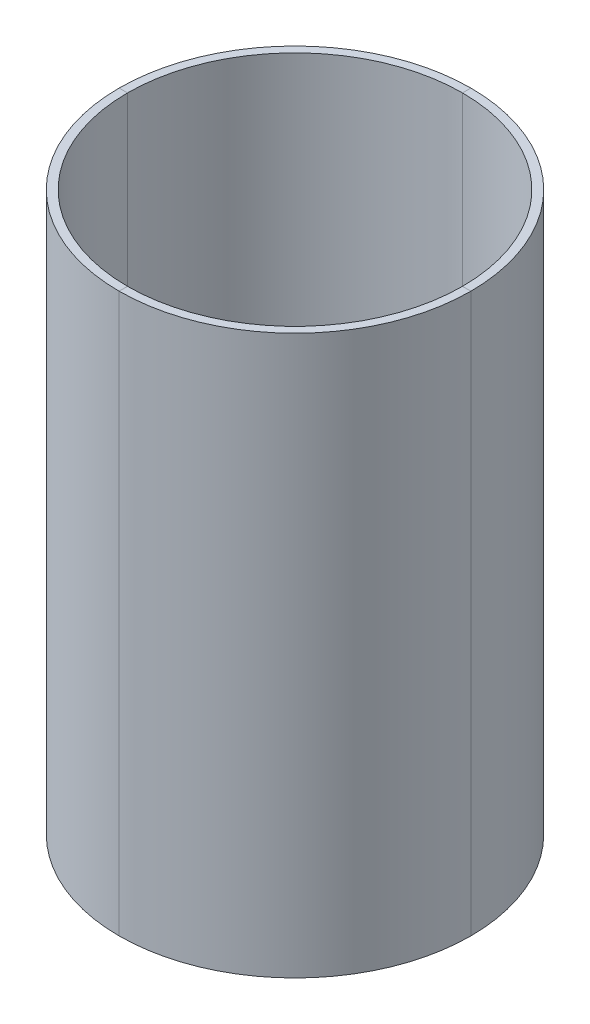
ISO-10303-21;
HEADER;
FILE_DESCRIPTION(('STEP AP214'),'2;1');
FILE_NAME('part.step','',(''),(''),'','','');
FILE_SCHEMA(('AUTOMOTIVE_DESIGN { 1 0 10303 214 1 1 1 1 }'));
ENDSEC;
DATA;
#1=APPLICATION_CONTEXT('core data for automotive mechanical design processes');
#2=APPLICATION_PROTOCOL_DEFINITION('international standard','automotive_design',2000,#1);
#3=PRODUCT_CONTEXT('',#1,'mechanical');
#4=PRODUCT('Part','Part','',(#3));
#5=PRODUCT_RELATED_PRODUCT_CATEGORY('part','',(#4));
#6=PRODUCT_DEFINITION_FORMATION('','',#4);
#7=PRODUCT_DEFINITION_CONTEXT('part definition',#1,'design');
#8=PRODUCT_DEFINITION('design','',#6,#7);
#9=PRODUCT_DEFINITION_SHAPE('','',#8);
#10=(LENGTH_UNIT() NAMED_UNIT(*) SI_UNIT(.MILLI.,.METRE.));
#11=(NAMED_UNIT(*) PLANE_ANGLE_UNIT() SI_UNIT($,.RADIAN.));
#12=(NAMED_UNIT(*) SI_UNIT($,.STERADIAN.) SOLID_ANGLE_UNIT());
#13=UNCERTAINTY_MEASURE_WITH_UNIT(LENGTH_MEASURE(1.E-05),#10,'distance_accuracy_value','');
#14=(GEOMETRIC_REPRESENTATION_CONTEXT(3) GLOBAL_UNCERTAINTY_ASSIGNED_CONTEXT((#13)) GLOBAL_UNIT_ASSIGNED_CONTEXT((#10,
#11,#12)) REPRESENTATION_CONTEXT('',''));
#15=CARTESIAN_POINT('',(0.,0.,0.));
#16=DIRECTION('',(0.,0.,1.));
#17=DIRECTION('',(1.,0.,0.));
#18=AXIS2_PLACEMENT_3D('',#15,#16,#17);
#19=CARTESIAN_POINT('',(-31.51,0.,0.01));
#20=DIRECTION('',(0.,-1.,0.));
#21=DIRECTION('',(0.,0.,-1.));
#22=AXIS2_PLACEMENT_3D('',#19,#20,#21);
#23=PLANE('',#22);
#24=DIRECTION('',(0.,0.,-1.));
#25=VECTOR('',#24,1.);
#26=CARTESIAN_POINT('',(0.,0.,-30.75));
#27=LINE('',#26,#25);
#28=CARTESIAN_POINT('',(0.,0.,-30.));
#29=VERTEX_POINT('',#28);
#30=CARTESIAN_POINT('',(0.,0.,-31.5));
#31=VERTEX_POINT('',#30);
#32=EDGE_CURVE('P0_E80',#29,#31,#27,.T.);
#33=ORIENTED_EDGE('',*,*,#32,.F.);
#34=CARTESIAN_POINT('',(0.,0.,0.));
#35=DIRECTION('',(0.,1.,0.));
#36=DIRECTION('',(0.,0.,1.));
#37=AXIS2_PLACEMENT_3D('',#34,#35,#36);
#38=CIRCLE('',#37,30.);
#39=CARTESIAN_POINT('',(-30.,0.,0.));
#40=VERTEX_POINT('',#39);
#41=EDGE_CURVE('P0_E74',#40,#29,#38,.F.);
#42=ORIENTED_EDGE('',*,*,#41,.F.);
#43=DIRECTION('',(-1.,0.,0.));
#44=VECTOR('',#43,1.);
#45=CARTESIAN_POINT('',(-15.75,0.,0.));
#46=LINE('',#45,#44);
#47=CARTESIAN_POINT('',(-31.5,0.,0.));
#48=VERTEX_POINT('',#47);
#49=EDGE_CURVE('P0_E82',#40,#48,#46,.T.);
#50=ORIENTED_EDGE('',*,*,#49,.T.);
#51=CARTESIAN_POINT('',(0.,0.,0.));
#52=DIRECTION('',(0.,-1.,0.));
#53=DIRECTION('',(0.,0.,-1.));
#54=AXIS2_PLACEMENT_3D('',#51,#52,#53);
#55=CIRCLE('',#54,31.5);
#56=EDGE_CURVE('P0_E76',#31,#48,#55,.F.);
#57=ORIENTED_EDGE('',*,*,#56,.F.);
#58=EDGE_LOOP('',(#33,#42,#50,#57));
#59=FACE_BOUND('',#58,.T.);
#60=ADVANCED_FACE('P0_F16',(#59),#23,.T.);
#61=CARTESIAN_POINT('',(0.,-0.01,-29.99));
#62=DIRECTION('',(1.,0.,0.));
#63=DIRECTION('',(0.,0.,-1.));
#64=AXIS2_PLACEMENT_3D('',#61,#62,#63);
#65=PLANE('',#64);
#66=DIRECTION('',(0.,1.,0.));
#67=VECTOR('',#66,1.);
#68=CARTESIAN_POINT('',(0.,50.,-30.));
#69=LINE('',#68,#67);
#70=CARTESIAN_POINT('',(0.,100.,-30.));
#71=VERTEX_POINT('',#70);
#72=EDGE_CURVE('P0_E61',#29,#71,#69,.T.);
#73=ORIENTED_EDGE('',*,*,#72,.F.);
#74=ORIENTED_EDGE('',*,*,#32,.T.);
#75=DIRECTION('',(0.,-1.,0.));
#76=VECTOR('',#75,1.);
#77=CARTESIAN_POINT('',(0.,50.,-31.5));
#78=LINE('',#77,#76);
#79=CARTESIAN_POINT('',(0.,100.,-31.5));
#80=VERTEX_POINT('',#79);
#81=EDGE_CURVE('P0_E64',#80,#31,#78,.T.);
#82=ORIENTED_EDGE('',*,*,#81,.F.);
#83=DIRECTION('',(0.,0.,-1.));
#84=VECTOR('',#83,1.);
#85=CARTESIAN_POINT('',(0.,100.,-15.75));
#86=LINE('',#85,#84);
#87=EDGE_CURVE('P0_E58',#71,#80,#86,.T.);
#88=ORIENTED_EDGE('',*,*,#87,.F.);
#89=EDGE_LOOP('',(#73,#74,#82,#88));
#90=FACE_BOUND('',#89,.T.);
#91=ADVANCED_FACE('P0_F59',(#90),#65,.T.);
#92=CARTESIAN_POINT('',(-31.51,100.,-31.51));
#93=DIRECTION('',(0.,1.,0.));
#94=DIRECTION('',(0.,0.,1.));
#95=AXIS2_PLACEMENT_3D('',#92,#93,#94);
#96=PLANE('',#95);
#97=ORIENTED_EDGE('',*,*,#87,.T.);
#98=CARTESIAN_POINT('',(0.,100.,0.));
#99=DIRECTION('',(0.,-1.,0.));
#100=DIRECTION('',(0.,0.,-1.));
#101=AXIS2_PLACEMENT_3D('',#98,#99,#100);
#102=CIRCLE('',#101,31.5);
#103=CARTESIAN_POINT('',(-31.5,100.,0.));
#104=VERTEX_POINT('',#103);
#105=EDGE_CURVE('P0_E20',#104,#80,#102,.T.);
#106=ORIENTED_EDGE('',*,*,#105,.F.);
#107=DIRECTION('',(1.,0.,0.));
#108=VECTOR('',#107,1.);
#109=CARTESIAN_POINT('',(-15.75,100.,0.));
#110=LINE('',#109,#108);
#111=CARTESIAN_POINT('',(-30.,100.,0.));
#112=VERTEX_POINT('',#111);
#113=EDGE_CURVE('P0_E35',#104,#112,#110,.T.);
#114=ORIENTED_EDGE('',*,*,#113,.T.);
#115=CARTESIAN_POINT('',(0.,100.,0.));
#116=DIRECTION('',(0.,1.,0.));
#117=DIRECTION('',(0.,0.,1.));
#118=AXIS2_PLACEMENT_3D('',#115,#116,#117);
#119=CIRCLE('',#118,30.);
#120=EDGE_CURVE('P0_E67',#71,#112,#119,.T.);
#121=ORIENTED_EDGE('',*,*,#120,.F.);
#122=EDGE_LOOP('',(#97,#106,#114,#121));
#123=FACE_BOUND('',#122,.T.);
#124=ADVANCED_FACE('P0_F68',(#123),#96,.T.);
#125=CARTESIAN_POINT('',(0.,100.,0.));
#126=DIRECTION('',(0.,-1.,0.));
#127=DIRECTION('',(0.,0.,-1.));
#128=AXIS2_PLACEMENT_3D('',#125,#126,#127);
#129=CYLINDRICAL_SURFACE('',#128,31.5);
#130=ORIENTED_EDGE('',*,*,#81,.T.);
#131=ORIENTED_EDGE('',*,*,#56,.T.);
#132=DIRECTION('',(0.,-1.,0.));
#133=VECTOR('',#132,1.);
#134=CARTESIAN_POINT('',(-31.5,50.,0.));
#135=LINE('',#134,#133);
#136=EDGE_CURVE('P0_E26',#104,#48,#135,.T.);
#137=ORIENTED_EDGE('',*,*,#136,.F.);
#138=ORIENTED_EDGE('',*,*,#105,.T.);
#139=EDGE_LOOP('',(#130,#131,#137,#138));
#140=FACE_BOUND('',#139,.T.);
#141=ADVANCED_FACE('P0_F89',(#140),#129,.T.);
#142=CARTESIAN_POINT('',(0.,0.,0.));
#143=DIRECTION('',(0.,1.,0.));
#144=DIRECTION('',(0.,0.,1.));
#145=AXIS2_PLACEMENT_3D('',#142,#143,#144);
#146=CYLINDRICAL_SURFACE('',#145,30.);
#147=ORIENTED_EDGE('',*,*,#72,.T.);
#148=ORIENTED_EDGE('',*,*,#120,.T.);
#149=DIRECTION('',(0.,1.,0.));
#150=VECTOR('',#149,1.);
#151=CARTESIAN_POINT('',(-30.,50.,0.));
#152=LINE('',#151,#150);
#153=EDGE_CURVE('P0_E11',#40,#112,#152,.T.);
#154=ORIENTED_EDGE('',*,*,#153,.F.);
#155=ORIENTED_EDGE('',*,*,#41,.T.);
#156=EDGE_LOOP('',(#147,#148,#154,#155));
#157=FACE_BOUND('',#156,.T.);
#158=ADVANCED_FACE('P0_F72',(#157),#146,.F.);
#159=CARTESIAN_POINT('',(-31.51,-0.01,0.));
#160=DIRECTION('',(0.,0.,1.));
#161=DIRECTION('',(1.,0.,0.));
#162=AXIS2_PLACEMENT_3D('',#159,#160,#161);
#163=PLANE('',#162);
#164=ORIENTED_EDGE('',*,*,#153,.T.);
#165=ORIENTED_EDGE('',*,*,#113,.F.);
#166=ORIENTED_EDGE('',*,*,#136,.T.);
#167=ORIENTED_EDGE('',*,*,#49,.F.);
#168=EDGE_LOOP('',(#164,#165,#166,#167));
#169=FACE_BOUND('',#168,.T.);
#170=ADVANCED_FACE('P0_F18',(#169),#163,.T.);
#171=CLOSED_SHELL('',(#60,#91,#124,#141,#158,#170));
#172=MANIFOLD_SOLID_BREP('P0_B1',#171);
#173=CARTESIAN_POINT('',(-31.51,100.,-0.01));
#174=DIRECTION('',(0.,1.,0.));
#175=DIRECTION('',(0.,0.,1.));
#176=AXIS2_PLACEMENT_3D('',#173,#174,#175);
#177=PLANE('',#176);
#178=DIRECTION('',(0.,0.,1.));
#179=VECTOR('',#178,1.);
#180=CARTESIAN_POINT('',(0.,100.,30.75));
#181=LINE('',#180,#179);
#182=CARTESIAN_POINT('',(0.,100.,30.));
#183=VERTEX_POINT('',#182);
#184=CARTESIAN_POINT('',(0.,100.,31.5));
#185=VERTEX_POINT('',#184);
#186=EDGE_CURVE('P1_E80',#183,#185,#181,.T.);
#187=ORIENTED_EDGE('',*,*,#186,.F.);
#188=CARTESIAN_POINT('',(0.,100.,0.));
#189=DIRECTION('',(0.,1.,0.));
#190=DIRECTION('',(0.,0.,1.));
#191=AXIS2_PLACEMENT_3D('',#188,#189,#190);
#192=CIRCLE('',#191,30.);
#193=CARTESIAN_POINT('',(-30.,100.,0.));
#194=VERTEX_POINT('',#193);
#195=EDGE_CURVE('P1_E74',#194,#183,#192,.T.);
#196=ORIENTED_EDGE('',*,*,#195,.F.);
#197=DIRECTION('',(-1.,0.,0.));
#198=VECTOR('',#197,1.);
#199=CARTESIAN_POINT('',(-15.75,100.,0.));
#200=LINE('',#199,#198);
#201=CARTESIAN_POINT('',(-31.5,100.,0.));
#202=VERTEX_POINT('',#201);
#203=EDGE_CURVE('P1_E82',#194,#202,#200,.T.);
#204=ORIENTED_EDGE('',*,*,#203,.T.);
#205=CARTESIAN_POINT('',(0.,100.,0.));
#206=DIRECTION('',(0.,-1.,0.));
#207=DIRECTION('',(0.,0.,-1.));
#208=AXIS2_PLACEMENT_3D('',#205,#206,#207);
#209=CIRCLE('',#208,31.5);
#210=EDGE_CURVE('P1_E76',#185,#202,#209,.T.);
#211=ORIENTED_EDGE('',*,*,#210,.F.);
#212=EDGE_LOOP('',(#187,#196,#204,#211));
#213=FACE_BOUND('',#212,.T.);
#214=ADVANCED_FACE('P1_F16',(#213),#177,.T.);
#215=CARTESIAN_POINT('',(0.,-0.01,31.51));
#216=DIRECTION('',(1.,0.,0.));
#217=DIRECTION('',(0.,0.,-1.));
#218=AXIS2_PLACEMENT_3D('',#215,#216,#217);
#219=PLANE('',#218);
#220=DIRECTION('',(0.,-1.,0.));
#221=VECTOR('',#220,1.);
#222=CARTESIAN_POINT('',(0.,50.,30.));
#223=LINE('',#222,#221);
#224=CARTESIAN_POINT('',(0.,0.,30.));
#225=VERTEX_POINT('',#224);
#226=EDGE_CURVE('P1_E61',#183,#225,#223,.T.);
#227=ORIENTED_EDGE('',*,*,#226,.F.);
#228=ORIENTED_EDGE('',*,*,#186,.T.);
#229=DIRECTION('',(0.,1.,0.));
#230=VECTOR('',#229,1.);
#231=CARTESIAN_POINT('',(0.,50.,31.5));
#232=LINE('',#231,#230);
#233=CARTESIAN_POINT('',(0.,0.,31.5));
#234=VERTEX_POINT('',#233);
#235=EDGE_CURVE('P1_E64',#234,#185,#232,.T.);
#236=ORIENTED_EDGE('',*,*,#235,.F.);
#237=DIRECTION('',(0.,0.,1.));
#238=VECTOR('',#237,1.);
#239=CARTESIAN_POINT('',(0.,0.,15.75));
#240=LINE('',#239,#238);
#241=EDGE_CURVE('P1_E58',#225,#234,#240,.T.);
#242=ORIENTED_EDGE('',*,*,#241,.F.);
#243=EDGE_LOOP('',(#227,#228,#236,#242));
#244=FACE_BOUND('',#243,.T.);
#245=ADVANCED_FACE('P1_F59',(#244),#219,.T.);
#246=CARTESIAN_POINT('',(-31.51,0.,31.51));
#247=DIRECTION('',(0.,-1.,0.));
#248=DIRECTION('',(0.,0.,-1.));
#249=AXIS2_PLACEMENT_3D('',#246,#247,#248);
#250=PLANE('',#249);
#251=ORIENTED_EDGE('',*,*,#241,.T.);
#252=CARTESIAN_POINT('',(0.,0.,0.));
#253=DIRECTION('',(0.,-1.,0.));
#254=DIRECTION('',(0.,0.,-1.));
#255=AXIS2_PLACEMENT_3D('',#252,#253,#254);
#256=CIRCLE('',#255,31.5);
#257=CARTESIAN_POINT('',(-31.5,0.,0.));
#258=VERTEX_POINT('',#257);
#259=EDGE_CURVE('P1_E20',#258,#234,#256,.F.);
#260=ORIENTED_EDGE('',*,*,#259,.F.);
#261=DIRECTION('',(1.,0.,0.));
#262=VECTOR('',#261,1.);
#263=CARTESIAN_POINT('',(-15.75,0.,0.));
#264=LINE('',#263,#262);
#265=CARTESIAN_POINT('',(-30.,0.,0.));
#266=VERTEX_POINT('',#265);
#267=EDGE_CURVE('P1_E35',#258,#266,#264,.T.);
#268=ORIENTED_EDGE('',*,*,#267,.T.);
#269=CARTESIAN_POINT('',(0.,0.,0.));
#270=DIRECTION('',(0.,1.,0.));
#271=DIRECTION('',(0.,0.,1.));
#272=AXIS2_PLACEMENT_3D('',#269,#270,#271);
#273=CIRCLE('',#272,30.);
#274=EDGE_CURVE('P1_E67',#225,#266,#273,.F.);
#275=ORIENTED_EDGE('',*,*,#274,.F.);
#276=EDGE_LOOP('',(#251,#260,#268,#275));
#277=FACE_BOUND('',#276,.T.);
#278=ADVANCED_FACE('P1_F68',(#277),#250,.T.);
#279=CARTESIAN_POINT('',(0.,100.,0.));
#280=DIRECTION('',(0.,-1.,0.));
#281=DIRECTION('',(0.,0.,-1.));
#282=AXIS2_PLACEMENT_3D('',#279,#280,#281);
#283=CYLINDRICAL_SURFACE('',#282,31.5);
#284=ORIENTED_EDGE('',*,*,#235,.T.);
#285=ORIENTED_EDGE('',*,*,#210,.T.);
#286=DIRECTION('',(0.,1.,0.));
#287=VECTOR('',#286,1.);
#288=CARTESIAN_POINT('',(-31.5,50.,0.));
#289=LINE('',#288,#287);
#290=EDGE_CURVE('P1_E26',#258,#202,#289,.T.);
#291=ORIENTED_EDGE('',*,*,#290,.F.);
#292=ORIENTED_EDGE('',*,*,#259,.T.);
#293=EDGE_LOOP('',(#284,#285,#291,#292));
#294=FACE_BOUND('',#293,.T.);
#295=ADVANCED_FACE('P1_F89',(#294),#283,.T.);
#296=CARTESIAN_POINT('',(0.,0.,0.));
#297=DIRECTION('',(0.,1.,0.));
#298=DIRECTION('',(0.,0.,1.));
#299=AXIS2_PLACEMENT_3D('',#296,#297,#298);
#300=CYLINDRICAL_SURFACE('',#299,30.);
#301=ORIENTED_EDGE('',*,*,#226,.T.);
#302=ORIENTED_EDGE('',*,*,#274,.T.);
#303=DIRECTION('',(0.,-1.,0.));
#304=VECTOR('',#303,1.);
#305=CARTESIAN_POINT('',(-30.,50.,0.));
#306=LINE('',#305,#304);
#307=EDGE_CURVE('P1_E11',#194,#266,#306,.T.);
#308=ORIENTED_EDGE('',*,*,#307,.F.);
#309=ORIENTED_EDGE('',*,*,#195,.T.);
#310=EDGE_LOOP('',(#301,#302,#308,#309));
#311=FACE_BOUND('',#310,.T.);
#312=ADVANCED_FACE('P1_F72',(#311),#300,.F.);
#313=CARTESIAN_POINT('',(-29.99,-0.01,0.));
#314=DIRECTION('',(0.,0.,-1.));
#315=DIRECTION('',(-1.,0.,0.));
#316=AXIS2_PLACEMENT_3D('',#313,#314,#315);
#317=PLANE('',#316);
#318=ORIENTED_EDGE('',*,*,#307,.T.);
#319=ORIENTED_EDGE('',*,*,#267,.F.);
#320=ORIENTED_EDGE('',*,*,#290,.T.);
#321=ORIENTED_EDGE('',*,*,#203,.F.);
#322=EDGE_LOOP('',(#318,#319,#320,#321));
#323=FACE_BOUND('',#322,.T.);
#324=ADVANCED_FACE('P1_F18',(#323),#317,.T.);
#325=CLOSED_SHELL('',(#214,#245,#278,#295,#312,#324));
#326=MANIFOLD_SOLID_BREP('P1_B1',#325);
#327=CARTESIAN_POINT('',(-0.01,0.,31.51));
#328=DIRECTION('',(0.,-1.,0.));
#329=DIRECTION('',(0.,0.,-1.));
#330=AXIS2_PLACEMENT_3D('',#327,#328,#329);
#331=PLANE('',#330);
#332=DIRECTION('',(0.,0.,1.));
#333=VECTOR('',#332,1.);
#334=CARTESIAN_POINT('',(0.,0.,30.75));
#335=LINE('',#334,#333);
#336=CARTESIAN_POINT('',(0.,0.,30.));
#337=VERTEX_POINT('',#336);
#338=CARTESIAN_POINT('',(0.,0.,31.5));
#339=VERTEX_POINT('',#338);
#340=EDGE_CURVE('P2_E80',#337,#339,#335,.T.);
#341=ORIENTED_EDGE('',*,*,#340,.F.);
#342=CARTESIAN_POINT('',(0.,0.,0.));
#343=DIRECTION('',(0.,1.,0.));
#344=DIRECTION('',(0.,0.,1.));
#345=AXIS2_PLACEMENT_3D('',#342,#343,#344);
#346=CIRCLE('',#345,30.);
#347=CARTESIAN_POINT('',(30.,0.,0.));
#348=VERTEX_POINT('',#347);
#349=EDGE_CURVE('P2_E74',#348,#337,#346,.F.);
#350=ORIENTED_EDGE('',*,*,#349,.F.);
#351=DIRECTION('',(1.,0.,0.));
#352=VECTOR('',#351,1.);
#353=CARTESIAN_POINT('',(15.75,0.,0.));
#354=LINE('',#353,#352);
#355=CARTESIAN_POINT('',(31.5,0.,0.));
#356=VERTEX_POINT('',#355);
#357=EDGE_CURVE('P2_E82',#348,#356,#354,.T.);
#358=ORIENTED_EDGE('',*,*,#357,.T.);
#359=CARTESIAN_POINT('',(0.,0.,0.));
#360=DIRECTION('',(0.,-1.,0.));
#361=DIRECTION('',(0.,0.,-1.));
#362=AXIS2_PLACEMENT_3D('',#359,#360,#361);
#363=CIRCLE('',#362,31.5);
#364=EDGE_CURVE('P2_E76',#339,#356,#363,.F.);
#365=ORIENTED_EDGE('',*,*,#364,.F.);
#366=EDGE_LOOP('',(#341,#350,#358,#365));
#367=FACE_BOUND('',#366,.T.);
#368=ADVANCED_FACE('P2_F16',(#367),#331,.T.);
#369=CARTESIAN_POINT('',(0.,-0.01,29.99));
#370=DIRECTION('',(-1.,0.,0.));
#371=DIRECTION('',(0.,0.,1.));
#372=AXIS2_PLACEMENT_3D('',#369,#370,#371);
#373=PLANE('',#372);
#374=DIRECTION('',(0.,1.,0.));
#375=VECTOR('',#374,1.);
#376=CARTESIAN_POINT('',(0.,50.,30.));
#377=LINE('',#376,#375);
#378=CARTESIAN_POINT('',(0.,100.,30.));
#379=VERTEX_POINT('',#378);
#380=EDGE_CURVE('P2_E61',#337,#379,#377,.T.);
#381=ORIENTED_EDGE('',*,*,#380,.F.);
#382=ORIENTED_EDGE('',*,*,#340,.T.);
#383=DIRECTION('',(0.,-1.,0.));
#384=VECTOR('',#383,1.);
#385=CARTESIAN_POINT('',(0.,50.,31.5));
#386=LINE('',#385,#384);
#387=CARTESIAN_POINT('',(0.,100.,31.5));
#388=VERTEX_POINT('',#387);
#389=EDGE_CURVE('P2_E64',#388,#339,#386,.T.);
#390=ORIENTED_EDGE('',*,*,#389,.F.);
#391=DIRECTION('',(0.,0.,1.));
#392=VECTOR('',#391,1.);
#393=CARTESIAN_POINT('',(0.,100.,15.75));
#394=LINE('',#393,#392);
#395=EDGE_CURVE('P2_E58',#379,#388,#394,.T.);
#396=ORIENTED_EDGE('',*,*,#395,.F.);
#397=EDGE_LOOP('',(#381,#382,#390,#396));
#398=FACE_BOUND('',#397,.T.);
#399=ADVANCED_FACE('P2_F59',(#398),#373,.T.);
#400=CARTESIAN_POINT('',(-0.01,100.,-0.01));
#401=DIRECTION('',(0.,1.,0.));
#402=DIRECTION('',(0.,0.,1.));
#403=AXIS2_PLACEMENT_3D('',#400,#401,#402);
#404=PLANE('',#403);
#405=ORIENTED_EDGE('',*,*,#395,.T.);
#406=CARTESIAN_POINT('',(0.,100.,0.));
#407=DIRECTION('',(0.,-1.,0.));
#408=DIRECTION('',(0.,0.,-1.));
#409=AXIS2_PLACEMENT_3D('',#406,#407,#408);
#410=CIRCLE('',#409,31.5);
#411=CARTESIAN_POINT('',(31.5,100.,0.));
#412=VERTEX_POINT('',#411);
#413=EDGE_CURVE('P2_E20',#412,#388,#410,.T.);
#414=ORIENTED_EDGE('',*,*,#413,.F.);
#415=DIRECTION('',(-1.,0.,0.));
#416=VECTOR('',#415,1.);
#417=CARTESIAN_POINT('',(15.75,100.,0.));
#418=LINE('',#417,#416);
#419=CARTESIAN_POINT('',(30.,100.,0.));
#420=VERTEX_POINT('',#419);
#421=EDGE_CURVE('P2_E35',#412,#420,#418,.T.);
#422=ORIENTED_EDGE('',*,*,#421,.T.);
#423=CARTESIAN_POINT('',(0.,100.,0.));
#424=DIRECTION('',(0.,1.,0.));
#425=DIRECTION('',(0.,0.,1.));
#426=AXIS2_PLACEMENT_3D('',#423,#424,#425);
#427=CIRCLE('',#426,30.);
#428=EDGE_CURVE('P2_E67',#379,#420,#427,.T.);
#429=ORIENTED_EDGE('',*,*,#428,.F.);
#430=EDGE_LOOP('',(#405,#414,#422,#429));
#431=FACE_BOUND('',#430,.T.);
#432=ADVANCED_FACE('P2_F68',(#431),#404,.T.);
#433=CARTESIAN_POINT('',(0.,100.,0.));
#434=DIRECTION('',(0.,-1.,0.));
#435=DIRECTION('',(0.,0.,-1.));
#436=AXIS2_PLACEMENT_3D('',#433,#434,#435);
#437=CYLINDRICAL_SURFACE('',#436,31.5);
#438=ORIENTED_EDGE('',*,*,#389,.T.);
#439=ORIENTED_EDGE('',*,*,#364,.T.);
#440=DIRECTION('',(0.,-1.,0.));
#441=VECTOR('',#440,1.);
#442=CARTESIAN_POINT('',(31.5,50.,0.));
#443=LINE('',#442,#441);
#444=EDGE_CURVE('P2_E26',#412,#356,#443,.T.);
#445=ORIENTED_EDGE('',*,*,#444,.F.);
#446=ORIENTED_EDGE('',*,*,#413,.T.);
#447=EDGE_LOOP('',(#438,#439,#445,#446));
#448=FACE_BOUND('',#447,.T.);
#449=ADVANCED_FACE('P2_F89',(#448),#437,.T.);
#450=CARTESIAN_POINT('',(0.,0.,0.));
#451=DIRECTION('',(0.,1.,0.));
#452=DIRECTION('',(0.,0.,1.));
#453=AXIS2_PLACEMENT_3D('',#450,#451,#452);
#454=CYLINDRICAL_SURFACE('',#453,30.);
#455=ORIENTED_EDGE('',*,*,#380,.T.);
#456=ORIENTED_EDGE('',*,*,#428,.T.);
#457=DIRECTION('',(0.,1.,0.));
#458=VECTOR('',#457,1.);
#459=CARTESIAN_POINT('',(30.,50.,0.));
#460=LINE('',#459,#458);
#461=EDGE_CURVE('P2_E11',#348,#420,#460,.T.);
#462=ORIENTED_EDGE('',*,*,#461,.F.);
#463=ORIENTED_EDGE('',*,*,#349,.T.);
#464=EDGE_LOOP('',(#455,#456,#462,#463));
#465=FACE_BOUND('',#464,.T.);
#466=ADVANCED_FACE('P2_F72',(#465),#454,.F.);
#467=CARTESIAN_POINT('',(31.51,-0.01,0.));
#468=DIRECTION('',(0.,0.,-1.));
#469=DIRECTION('',(-1.,0.,0.));
#470=AXIS2_PLACEMENT_3D('',#467,#468,#469);
#471=PLANE('',#470);
#472=ORIENTED_EDGE('',*,*,#461,.T.);
#473=ORIENTED_EDGE('',*,*,#421,.F.);
#474=ORIENTED_EDGE('',*,*,#444,.T.);
#475=ORIENTED_EDGE('',*,*,#357,.F.);
#476=EDGE_LOOP('',(#472,#473,#474,#475));
#477=FACE_BOUND('',#476,.T.);
#478=ADVANCED_FACE('P2_F18',(#477),#471,.T.);
#479=CLOSED_SHELL('',(#368,#399,#432,#449,#466,#478));
#480=MANIFOLD_SOLID_BREP('P2_B1',#479);
#481=CARTESIAN_POINT('',(-0.01,100.,-31.51));
#482=DIRECTION('',(0.,1.,0.));
#483=DIRECTION('',(0.,0.,1.));
#484=AXIS2_PLACEMENT_3D('',#481,#482,#483);
#485=PLANE('',#484);
#486=DIRECTION('',(0.,0.,-1.));
#487=VECTOR('',#486,1.);
#488=CARTESIAN_POINT('',(0.,100.,-30.75));
#489=LINE('',#488,#487);
#490=CARTESIAN_POINT('',(0.,100.,-30.));
#491=VERTEX_POINT('',#490);
#492=CARTESIAN_POINT('',(0.,100.,-31.5));
#493=VERTEX_POINT('',#492);
#494=EDGE_CURVE('P3_E80',#491,#493,#489,.T.);
#495=ORIENTED_EDGE('',*,*,#494,.F.);
#496=CARTESIAN_POINT('',(0.,100.,0.));
#497=DIRECTION('',(0.,1.,0.));
#498=DIRECTION('',(0.,0.,1.));
#499=AXIS2_PLACEMENT_3D('',#496,#497,#498);
#500=CIRCLE('',#499,30.);
#501=CARTESIAN_POINT('',(30.,100.,0.));
#502=VERTEX_POINT('',#501);
#503=EDGE_CURVE('P3_E74',#502,#491,#500,.T.);
#504=ORIENTED_EDGE('',*,*,#503,.F.);
#505=DIRECTION('',(1.,0.,0.));
#506=VECTOR('',#505,1.);
#507=CARTESIAN_POINT('',(15.75,100.,0.));
#508=LINE('',#507,#506);
#509=CARTESIAN_POINT('',(31.5,100.,0.));
#510=VERTEX_POINT('',#509);
#511=EDGE_CURVE('P3_E82',#502,#510,#508,.T.);
#512=ORIENTED_EDGE('',*,*,#511,.T.);
#513=CARTESIAN_POINT('',(0.,100.,0.));
#514=DIRECTION('',(0.,-1.,0.));
#515=DIRECTION('',(0.,0.,-1.));
#516=AXIS2_PLACEMENT_3D('',#513,#514,#515);
#517=CIRCLE('',#516,31.5);
#518=EDGE_CURVE('P3_E76',#493,#510,#517,.T.);
#519=ORIENTED_EDGE('',*,*,#518,.F.);
#520=EDGE_LOOP('',(#495,#504,#512,#519));
#521=FACE_BOUND('',#520,.T.);
#522=ADVANCED_FACE('P3_F16',(#521),#485,.T.);
#523=CARTESIAN_POINT('',(0.,-0.01,-31.51));
#524=DIRECTION('',(-1.,0.,0.));
#525=DIRECTION('',(0.,0.,1.));
#526=AXIS2_PLACEMENT_3D('',#523,#524,#525);
#527=PLANE('',#526);
#528=DIRECTION('',(0.,-1.,0.));
#529=VECTOR('',#528,1.);
#530=CARTESIAN_POINT('',(0.,50.,-30.));
#531=LINE('',#530,#529);
#532=CARTESIAN_POINT('',(0.,0.,-30.));
#533=VERTEX_POINT('',#532);
#534=EDGE_CURVE('P3_E61',#491,#533,#531,.T.);
#535=ORIENTED_EDGE('',*,*,#534,.F.);
#536=ORIENTED_EDGE('',*,*,#494,.T.);
#537=DIRECTION('',(0.,1.,0.));
#538=VECTOR('',#537,1.);
#539=CARTESIAN_POINT('',(0.,50.,-31.5));
#540=LINE('',#539,#538);
#541=CARTESIAN_POINT('',(0.,0.,-31.5));
#542=VERTEX_POINT('',#541);
#543=EDGE_CURVE('P3_E64',#542,#493,#540,.T.);
#544=ORIENTED_EDGE('',*,*,#543,.F.);
#545=DIRECTION('',(0.,0.,-1.));
#546=VECTOR('',#545,1.);
#547=CARTESIAN_POINT('',(0.,0.,-15.75));
#548=LINE('',#547,#546);
#549=EDGE_CURVE('P3_E58',#533,#542,#548,.T.);
#550=ORIENTED_EDGE('',*,*,#549,.F.);
#551=EDGE_LOOP('',(#535,#536,#544,#550));
#552=FACE_BOUND('',#551,.T.);
#553=ADVANCED_FACE('P3_F59',(#552),#527,.T.);
#554=CARTESIAN_POINT('',(-0.01,0.,0.01));
#555=DIRECTION('',(0.,-1.,0.));
#556=DIRECTION('',(0.,0.,-1.));
#557=AXIS2_PLACEMENT_3D('',#554,#555,#556);
#558=PLANE('',#557);
#559=ORIENTED_EDGE('',*,*,#549,.T.);
#560=CARTESIAN_POINT('',(0.,0.,0.));
#561=DIRECTION('',(0.,-1.,0.));
#562=DIRECTION('',(0.,0.,-1.));
#563=AXIS2_PLACEMENT_3D('',#560,#561,#562);
#564=CIRCLE('',#563,31.5);
#565=CARTESIAN_POINT('',(31.5,0.,0.));
#566=VERTEX_POINT('',#565);
#567=EDGE_CURVE('P3_E20',#566,#542,#564,.F.);
#568=ORIENTED_EDGE('',*,*,#567,.F.);
#569=DIRECTION('',(-1.,0.,0.));
#570=VECTOR('',#569,1.);
#571=CARTESIAN_POINT('',(15.75,0.,0.));
#572=LINE('',#571,#570);
#573=CARTESIAN_POINT('',(30.,0.,0.));
#574=VERTEX_POINT('',#573);
#575=EDGE_CURVE('P3_E35',#566,#574,#572,.T.);
#576=ORIENTED_EDGE('',*,*,#575,.T.);
#577=CARTESIAN_POINT('',(0.,0.,0.));
#578=DIRECTION('',(0.,1.,0.));
#579=DIRECTION('',(0.,0.,1.));
#580=AXIS2_PLACEMENT_3D('',#577,#578,#579);
#581=CIRCLE('',#580,30.);
#582=EDGE_CURVE('P3_E67',#533,#574,#581,.F.);
#583=ORIENTED_EDGE('',*,*,#582,.F.);
#584=EDGE_LOOP('',(#559,#568,#576,#583));
#585=FACE_BOUND('',#584,.T.);
#586=ADVANCED_FACE('P3_F68',(#585),#558,.T.);
#587=CARTESIAN_POINT('',(0.,100.,0.));
#588=DIRECTION('',(0.,-1.,0.));
#589=DIRECTION('',(0.,0.,-1.));
#590=AXIS2_PLACEMENT_3D('',#587,#588,#589);
#591=CYLINDRICAL_SURFACE('',#590,31.5);
#592=ORIENTED_EDGE('',*,*,#543,.T.);
#593=ORIENTED_EDGE('',*,*,#518,.T.);
#594=DIRECTION('',(0.,1.,0.));
#595=VECTOR('',#594,1.);
#596=CARTESIAN_POINT('',(31.5,50.,0.));
#597=LINE('',#596,#595);
#598=EDGE_CURVE('P3_E26',#566,#510,#597,.T.);
#599=ORIENTED_EDGE('',*,*,#598,.F.);
#600=ORIENTED_EDGE('',*,*,#567,.T.);
#601=EDGE_LOOP('',(#592,#593,#599,#600));
#602=FACE_BOUND('',#601,.T.);
#603=ADVANCED_FACE('P3_F89',(#602),#591,.T.);
#604=CARTESIAN_POINT('',(0.,0.,0.));
#605=DIRECTION('',(0.,1.,0.));
#606=DIRECTION('',(0.,0.,1.));
#607=AXIS2_PLACEMENT_3D('',#604,#605,#606);
#608=CYLINDRICAL_SURFACE('',#607,30.);
#609=ORIENTED_EDGE('',*,*,#534,.T.);
#610=ORIENTED_EDGE('',*,*,#582,.T.);
#611=DIRECTION('',(0.,-1.,0.));
#612=VECTOR('',#611,1.);
#613=CARTESIAN_POINT('',(30.,50.,0.));
#614=LINE('',#613,#612);
#615=EDGE_CURVE('P3_E11',#502,#574,#614,.T.);
#616=ORIENTED_EDGE('',*,*,#615,.F.);
#617=ORIENTED_EDGE('',*,*,#503,.T.);
#618=EDGE_LOOP('',(#609,#610,#616,#617));
#619=FACE_BOUND('',#618,.T.);
#620=ADVANCED_FACE('P3_F72',(#619),#608,.F.);
#621=CARTESIAN_POINT('',(29.99,-0.01,0.));
#622=DIRECTION('',(0.,0.,1.));
#623=DIRECTION('',(1.,0.,0.));
#624=AXIS2_PLACEMENT_3D('',#621,#622,#623);
#625=PLANE('',#624);
#626=ORIENTED_EDGE('',*,*,#615,.T.);
#627=ORIENTED_EDGE('',*,*,#575,.F.);
#628=ORIENTED_EDGE('',*,*,#598,.T.);
#629=ORIENTED_EDGE('',*,*,#511,.F.);
#630=EDGE_LOOP('',(#626,#627,#628,#629));
#631=FACE_BOUND('',#630,.T.);
#632=ADVANCED_FACE('P3_F18',(#631),#625,.T.);
#633=CLOSED_SHELL('',(#522,#553,#586,#603,#620,#632));
#634=MANIFOLD_SOLID_BREP('P3_B1',#633);
#635=ADVANCED_BREP_SHAPE_REPRESENTATION('',(#18,#172,#326,#480,#634),#14);
#636=SHAPE_DEFINITION_REPRESENTATION(#9,#635);
ENDSEC;
END-ISO-10303-21;
